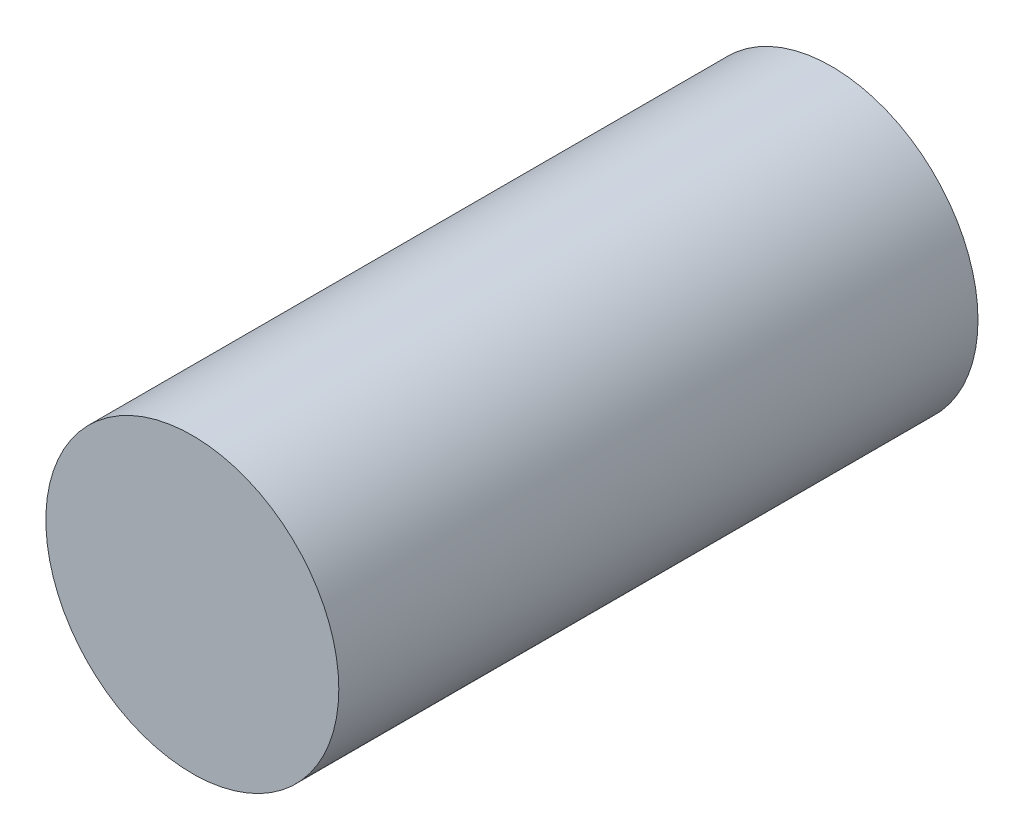
ISO-10303-21;
HEADER;
FILE_DESCRIPTION(('STEP AP214'),'2;1');
FILE_NAME('part.step','',(''),(''),'','','');
FILE_SCHEMA(('AUTOMOTIVE_DESIGN { 1 0 10303 214 1 1 1 1 }'));
ENDSEC;
DATA;
#1=APPLICATION_CONTEXT('core data for automotive mechanical design processes');
#2=APPLICATION_PROTOCOL_DEFINITION('international standard','automotive_design',2000,#1);
#3=PRODUCT_CONTEXT('',#1,'mechanical');
#4=PRODUCT('Part','Part','',(#3));
#5=PRODUCT_RELATED_PRODUCT_CATEGORY('part','',(#4));
#6=PRODUCT_DEFINITION_FORMATION('','',#4);
#7=PRODUCT_DEFINITION_CONTEXT('part definition',#1,'design');
#8=PRODUCT_DEFINITION('design','',#6,#7);
#9=PRODUCT_DEFINITION_SHAPE('','',#8);
#10=(LENGTH_UNIT() NAMED_UNIT(*) SI_UNIT(.MILLI.,.METRE.));
#11=(NAMED_UNIT(*) PLANE_ANGLE_UNIT() SI_UNIT($,.RADIAN.));
#12=(NAMED_UNIT(*) SI_UNIT($,.STERADIAN.) SOLID_ANGLE_UNIT());
#13=UNCERTAINTY_MEASURE_WITH_UNIT(LENGTH_MEASURE(1.E-05),#10,'distance_accuracy_value','');
#14=(GEOMETRIC_REPRESENTATION_CONTEXT(3) GLOBAL_UNCERTAINTY_ASSIGNED_CONTEXT((#13)) GLOBAL_UNIT_ASSIGNED_CONTEXT((#10,
#11,#12)) REPRESENTATION_CONTEXT('',''));
#15=CARTESIAN_POINT('',(0.,0.,0.));
#16=DIRECTION('',(0.,0.,1.));
#17=DIRECTION('',(1.,0.,0.));
#18=AXIS2_PLACEMENT_3D('',#15,#16,#17);
#19=CARTESIAN_POINT('',(0.,0.,24.));
#20=DIRECTION('',(0.,0.,-1.));
#21=DIRECTION('',(-1.,0.,0.));
#22=AXIS2_PLACEMENT_3D('',#19,#20,#21);
#23=CYLINDRICAL_SURFACE('',#22,5.5);
#24=CARTESIAN_POINT('',(0.,0.,24.));
#25=DIRECTION('',(0.,0.,1.));
#26=DIRECTION('',(1.,0.,0.));
#27=AXIS2_PLACEMENT_3D('',#24,#25,#26);
#28=CIRCLE('',#27,5.5);
#29=CARTESIAN_POINT('',(5.5,0.,24.));
#30=VERTEX_POINT('',#29);
#31=EDGE_CURVE('E10',#30,#30,#28,.T.);
#32=ORIENTED_EDGE('',*,*,#31,.F.);
#33=EDGE_LOOP('',(#32));
#34=FACE_BOUND('',#33,.T.);
#35=CARTESIAN_POINT('',(0.,0.,0.));
#36=DIRECTION('',(0.,0.,1.));
#37=DIRECTION('',(1.,0.,0.));
#38=AXIS2_PLACEMENT_3D('',#35,#36,#37);
#39=CIRCLE('',#38,5.5);
#40=CARTESIAN_POINT('',(5.5,0.,0.));
#41=VERTEX_POINT('',#40);
#42=EDGE_CURVE('E32',#41,#41,#39,.T.);
#43=ORIENTED_EDGE('',*,*,#42,.T.);
#44=EDGE_LOOP('',(#43));
#45=FACE_BOUND('',#44,.T.);
#46=ADVANCED_FACE('F29',(#34,#45),#23,.T.);
#47=CARTESIAN_POINT('',(0.,0.,24.));
#48=DIRECTION('',(0.,0.,1.));
#49=DIRECTION('',(1.,0.,0.));
#50=AXIS2_PLACEMENT_3D('',#47,#48,#49);
#51=PLANE('',#50);
#52=ORIENTED_EDGE('',*,*,#31,.T.);
#53=EDGE_LOOP('',(#52));
#54=FACE_BOUND('',#53,.T.);
#55=ADVANCED_FACE('F44',(#54),#51,.T.);
#56=CARTESIAN_POINT('',(0.,0.,0.));
#57=DIRECTION('',(0.,0.,1.));
#58=DIRECTION('',(1.,0.,0.));
#59=AXIS2_PLACEMENT_3D('',#56,#57,#58);
#60=PLANE('',#59);
#61=ORIENTED_EDGE('',*,*,#42,.F.);
#62=EDGE_LOOP('',(#61));
#63=FACE_BOUND('',#62,.T.);
#64=ADVANCED_FACE('F42',(#63),#60,.F.);
#65=CLOSED_SHELL('',(#46,#55,#64));
#66=MANIFOLD_SOLID_BREP('B2',#65);
#67=ADVANCED_BREP_SHAPE_REPRESENTATION('',(#18,#66),#14);
#68=SHAPE_DEFINITION_REPRESENTATION(#9,#67);
ENDSEC;
END-ISO-10303-21;
